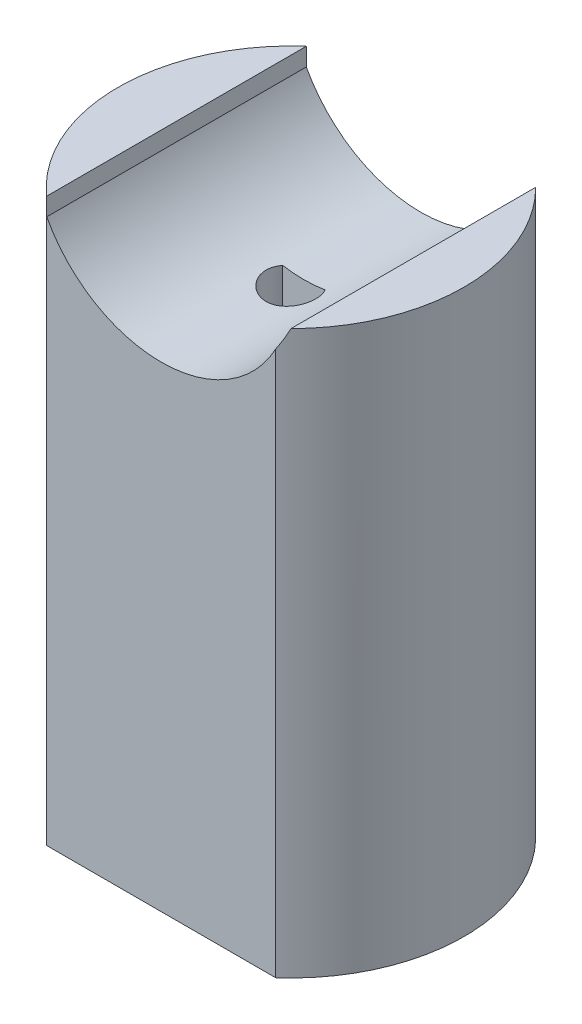
ISO-10303-21;
HEADER;
FILE_DESCRIPTION(('STEP AP214'),'2;1');
FILE_NAME('part.step','',(''),(''),'','','');
FILE_SCHEMA(('AUTOMOTIVE_DESIGN { 1 0 10303 214 1 1 1 1 }'));
ENDSEC;
DATA;
#1=APPLICATION_CONTEXT('core data for automotive mechanical design processes');
#2=APPLICATION_PROTOCOL_DEFINITION('international standard','automotive_design',2000,#1);
#3=PRODUCT_CONTEXT('',#1,'mechanical');
#4=PRODUCT('Part','Part','',(#3));
#5=PRODUCT_RELATED_PRODUCT_CATEGORY('part','',(#4));
#6=PRODUCT_DEFINITION_FORMATION('','',#4);
#7=PRODUCT_DEFINITION_CONTEXT('part definition',#1,'design');
#8=PRODUCT_DEFINITION('design','',#6,#7);
#9=PRODUCT_DEFINITION_SHAPE('','',#8);
#10=(LENGTH_UNIT() NAMED_UNIT(*) SI_UNIT(.MILLI.,.METRE.));
#11=(NAMED_UNIT(*) PLANE_ANGLE_UNIT() SI_UNIT($,.RADIAN.));
#12=(NAMED_UNIT(*) SI_UNIT($,.STERADIAN.) SOLID_ANGLE_UNIT());
#13=UNCERTAINTY_MEASURE_WITH_UNIT(LENGTH_MEASURE(1.E-05),#10,'distance_accuracy_value','');
#14=(GEOMETRIC_REPRESENTATION_CONTEXT(3) GLOBAL_UNCERTAINTY_ASSIGNED_CONTEXT((#13)) GLOBAL_UNIT_ASSIGNED_CONTEXT((#10,
#11,#12)) REPRESENTATION_CONTEXT('',''));
#15=CARTESIAN_POINT('',(0.,0.,0.));
#16=DIRECTION('',(0.,0.,1.));
#17=DIRECTION('',(1.,0.,0.));
#18=AXIS2_PLACEMENT_3D('',#15,#16,#17);
#19=CARTESIAN_POINT('',(0.,30.,0.));
#20=DIRECTION('',(0.,-1.,0.));
#21=DIRECTION('',(0.,0.,-1.));
#22=AXIS2_PLACEMENT_3D('',#19,#20,#21);
#23=CYLINDRICAL_SURFACE('',#22,20.);
#24=DIRECTION('',(0.,1.,0.));
#25=VECTOR('',#24,1.);
#26=CARTESIAN_POINT('',(13.228756555323,0.,-15.));
#27=LINE('',#26,#25);
#28=CARTESIAN_POINT('',(13.228756555323,0.,-15.));
#29=VERTEX_POINT('',#28);
#30=CARTESIAN_POINT('',(13.228756555323,62.9289321881345,-15.));
#31=VERTEX_POINT('',#30);
#32=EDGE_CURVE('E157',#29,#31,#27,.T.);
#33=ORIENTED_EDGE('',*,*,#32,.T.);
#34=CARTESIAN_POINT('',(13.228756555323,62.9289321881345,-15.));
#35=CARTESIAN_POINT('',(13.3167171860087,63.0934975431371,-14.9224292995175));
#36=CARTESIAN_POINT('',(13.4018379344791,63.2601242408515,-14.8459809964981));
#37=CARTESIAN_POINT('',(13.566111555391,63.5972085897078,-14.6960179273488));
#38=CARTESIAN_POINT('',(13.6452735857657,63.7676598169233,-14.6224987448622));
#39=CARTESIAN_POINT('',(13.7976215419076,64.1126245505811,-14.4788329603066));
#40=CARTESIAN_POINT('',(13.8708072510773,64.2871382039623,-14.4086864805111));
#41=CARTESIAN_POINT('',(14.011112597924,64.6404390448926,-14.2722923314463));
#42=CARTESIAN_POINT('',(14.0782225176162,64.8192325199306,-14.2060509652797));
#43=CARTESIAN_POINT('',(14.1421356237309,65.,-14.142135623731));
#44=B_SPLINE_CURVE_WITH_KNOTS('',3,(#34,#35,#36,#37,#38,#39,#40,#41,#42,#43),.UNSPECIFIED.,.F.,
.F.,(4,2,2,2,4),(0.,0.606221172995632,1.21149077206819,1.81678229797356,2.42302546377693),.UNSPECIFIED.);
#45=CARTESIAN_POINT('',(14.1421356237309,65.,-14.142135623731));
#46=VERTEX_POINT('',#45);
#47=EDGE_CURVE('E168',#31,#46,#44,.T.);
#48=ORIENTED_EDGE('',*,*,#47,.T.);
#49=CARTESIAN_POINT('',(0.,65.,0.));
#50=DIRECTION('',(0.,-1.,0.));
#51=DIRECTION('',(0.,0.,-1.));
#52=AXIS2_PLACEMENT_3D('',#49,#50,#51);
#53=CIRCLE('',#52,20.);
#54=CARTESIAN_POINT('',(14.1421356237309,65.,14.142135623731));
#55=VERTEX_POINT('',#54);
#56=EDGE_CURVE('E11',#46,#55,#53,.T.);
#57=ORIENTED_EDGE('',*,*,#56,.T.);
#58=CARTESIAN_POINT('',(14.1421356237309,65.,14.142135623731));
#59=CARTESIAN_POINT('',(14.0782225176162,64.8192325199306,14.2060509652797));
#60=CARTESIAN_POINT('',(14.011112597924,64.6404390448926,14.2722923314463));
#61=CARTESIAN_POINT('',(13.8708072510773,64.2871382039623,14.4086864805111));
#62=CARTESIAN_POINT('',(13.7976215419076,64.1126245505811,14.4788329603066));
#63=CARTESIAN_POINT('',(13.6452735857657,63.7676598169233,14.6224987448622));
#64=CARTESIAN_POINT('',(13.566111555391,63.5972085897078,14.6960179273488));
#65=CARTESIAN_POINT('',(13.4018379344791,63.2601242408515,14.8459809964981));
#66=CARTESIAN_POINT('',(13.3167171860087,63.0934975431371,14.9224292995175));
#67=CARTESIAN_POINT('',(13.228756555323,62.9289321881345,15.));
#68=B_SPLINE_CURVE_WITH_KNOTS('',3,(#58,#59,#60,#61,#62,#63,#64,#65,#66,#67),.UNSPECIFIED.,.F.,
.F.,(4,2,2,2,4),(0.,0.606243165803374,1.21153469170874,1.8168042907813,2.42302546377693),.UNSPECIFIED.);
#69=CARTESIAN_POINT('',(13.228756555323,62.9289321881345,15.));
#70=VERTEX_POINT('',#69);
#71=EDGE_CURVE('E187',#55,#70,#68,.T.);
#72=ORIENTED_EDGE('',*,*,#71,.T.);
#73=DIRECTION('',(0.,1.,0.));
#74=VECTOR('',#73,1.);
#75=CARTESIAN_POINT('',(13.228756555323,0.,15.));
#76=LINE('',#75,#74);
#77=CARTESIAN_POINT('',(13.228756555323,0.,15.));
#78=VERTEX_POINT('',#77);
#79=EDGE_CURVE('E169',#78,#70,#76,.T.);
#80=ORIENTED_EDGE('',*,*,#79,.F.);
#81=CARTESIAN_POINT('',(0.,0.,0.));
#82=DIRECTION('',(0.,1.,0.));
#83=DIRECTION('',(0.,0.,1.));
#84=AXIS2_PLACEMENT_3D('',#81,#82,#83);
#85=CIRCLE('',#84,20.);
#86=EDGE_CURVE('E141',#78,#29,#85,.T.);
#87=ORIENTED_EDGE('',*,*,#86,.T.);
#88=EDGE_LOOP('',(#33,#48,#57,#72,#80,#87));
#89=FACE_BOUND('',#88,.T.);
#90=ADVANCED_FACE('F41',(#89),#23,.T.);
#91=DIRECTION('',(0.,-1.,0.));
#92=VECTOR('',#91,1.);
#93=CARTESIAN_POINT('',(-13.228756555323,0.,15.));
#94=LINE('',#93,#92);
#95=CARTESIAN_POINT('',(-13.228756555323,65.,15.));
#96=VERTEX_POINT('',#95);
#97=CARTESIAN_POINT('',(-13.228756555323,62.9289321881345,15.));
#98=VERTEX_POINT('',#97);
#99=EDGE_CURVE('E126',#96,#98,#94,.T.);
#100=ORIENTED_EDGE('',*,*,#99,.F.);
#101=CARTESIAN_POINT('',(0.,65.,0.));
#102=DIRECTION('',(0.,-1.,0.));
#103=DIRECTION('',(0.,0.,-1.));
#104=AXIS2_PLACEMENT_3D('',#101,#102,#103);
#105=CIRCLE('',#104,20.);
#106=CARTESIAN_POINT('',(-13.228756555323,65.,-15.));
#107=VERTEX_POINT('',#106);
#108=EDGE_CURVE('E51',#96,#107,#105,.T.);
#109=ORIENTED_EDGE('',*,*,#108,.T.);
#110=DIRECTION('',(0.,-1.,0.));
#111=VECTOR('',#110,1.);
#112=CARTESIAN_POINT('',(-13.228756555323,0.,-15.));
#113=LINE('',#112,#111);
#114=CARTESIAN_POINT('',(-13.228756555323,62.9289321881345,-15.));
#115=VERTEX_POINT('',#114);
#116=EDGE_CURVE('E115',#107,#115,#113,.T.);
#117=ORIENTED_EDGE('',*,*,#116,.T.);
#118=DIRECTION('',(0.,1.,0.));
#119=VECTOR('',#118,1.);
#120=CARTESIAN_POINT('',(-13.228756555323,0.,-15.));
#121=LINE('',#120,#119);
#122=CARTESIAN_POINT('',(-13.228756555323,0.,-15.));
#123=VERTEX_POINT('',#122);
#124=EDGE_CURVE('E161',#123,#115,#121,.T.);
#125=ORIENTED_EDGE('',*,*,#124,.F.);
#126=CARTESIAN_POINT('',(-13.228756555323,0.,15.));
#127=VERTEX_POINT('',#126);
#128=EDGE_CURVE('E145',#123,#127,#85,.T.);
#129=ORIENTED_EDGE('',*,*,#128,.T.);
#130=DIRECTION('',(0.,1.,0.));
#131=VECTOR('',#130,1.);
#132=CARTESIAN_POINT('',(-13.228756555323,0.,15.));
#133=LINE('',#132,#131);
#134=EDGE_CURVE('E137',#127,#98,#133,.T.);
#135=ORIENTED_EDGE('',*,*,#134,.T.);
#136=EDGE_LOOP('',(#100,#109,#117,#125,#129,#135));
#137=FACE_BOUND('',#136,.T.);
#138=ADVANCED_FACE('F124',(#137),#23,.T.);
#139=CARTESIAN_POINT('',(0.,0.,0.));
#140=DIRECTION('',(0.,1.,0.));
#141=DIRECTION('',(0.,0.,1.));
#142=AXIS2_PLACEMENT_3D('',#139,#140,#141);
#143=PLANE('',#142);
#144=CARTESIAN_POINT('',(0.,0.,0.));
#145=DIRECTION('',(0.,1.,0.));
#146=DIRECTION('',(0.,0.,1.));
#147=AXIS2_PLACEMENT_3D('',#144,#145,#146);
#148=CIRCLE('',#147,2.875);
#149=CARTESIAN_POINT('',(-2.45267710879357,0.,-1.5));
#150=VERTEX_POINT('',#149);
#151=CARTESIAN_POINT('',(2.45267710879357,0.,-1.5));
#152=VERTEX_POINT('',#151);
#153=EDGE_CURVE('E150',#150,#152,#148,.T.);
#154=ORIENTED_EDGE('',*,*,#153,.T.);
#155=DIRECTION('',(1.,0.,0.));
#156=VECTOR('',#155,1.);
#157=CARTESIAN_POINT('',(0.,0.,-1.5));
#158=LINE('',#157,#156);
#159=EDGE_CURVE('E146',#150,#152,#158,.T.);
#160=ORIENTED_EDGE('',*,*,#159,.F.);
#161=EDGE_LOOP('',(#154,#160));
#162=FACE_BOUND('',#161,.T.);
#163=ORIENTED_EDGE('',*,*,#86,.F.);
#164=DIRECTION('',(-1.,0.,0.));
#165=VECTOR('',#164,1.);
#166=CARTESIAN_POINT('',(0.,0.,15.));
#167=LINE('',#166,#165);
#168=EDGE_CURVE('E165',#78,#127,#167,.T.);
#169=ORIENTED_EDGE('',*,*,#168,.T.);
#170=ORIENTED_EDGE('',*,*,#128,.F.);
#171=DIRECTION('',(-1.,0.,0.));
#172=VECTOR('',#171,1.);
#173=CARTESIAN_POINT('',(0.,0.,-15.));
#174=LINE('',#173,#172);
#175=EDGE_CURVE('E162',#29,#123,#174,.T.);
#176=ORIENTED_EDGE('',*,*,#175,.F.);
#177=EDGE_LOOP('',(#163,#169,#170,#176));
#178=FACE_BOUND('',#177,.T.);
#179=ADVANCED_FACE('F235',(#162,#178),#143,.F.);
#180=CARTESIAN_POINT('',(0.,15.,2.74264068711928));
#181=DIRECTION('',(0.,0.,-1.));
#182=DIRECTION('',(-1.,0.,0.));
#183=AXIS2_PLACEMENT_3D('',#180,#181,#182);
#184=CYLINDRICAL_SURFACE('',#183,1.5);
#185=CARTESIAN_POINT('',(0.,15.,-1.5));
#186=DIRECTION('',(0.,0.,-1.));
#187=DIRECTION('',(-1.,0.,0.));
#188=AXIS2_PLACEMENT_3D('',#185,#186,#187);
#189=CIRCLE('',#188,1.5);
#190=CARTESIAN_POINT('',(-1.5,15.,-1.5));
#191=VERTEX_POINT('',#190);
#192=EDGE_CURVE('E136',#191,#191,#189,.F.);
#193=ORIENTED_EDGE('',*,*,#192,.T.);
#194=EDGE_LOOP('',(#193));
#195=FACE_BOUND('',#194,.T.);
#196=CARTESIAN_POINT('',(0.,15.,-15.));
#197=DIRECTION('',(0.,0.,-1.));
#198=DIRECTION('',(-1.,0.,0.));
#199=AXIS2_PLACEMENT_3D('',#196,#197,#198);
#200=CIRCLE('',#199,1.5);
#201=CARTESIAN_POINT('',(-1.5,15.,-15.));
#202=VERTEX_POINT('',#201);
#203=EDGE_CURVE('E133',#202,#202,#200,.F.);
#204=ORIENTED_EDGE('',*,*,#203,.F.);
#205=EDGE_LOOP('',(#204));
#206=FACE_BOUND('',#205,.T.);
#207=ADVANCED_FACE('F262',(#195,#206),#184,.F.);
#208=CARTESIAN_POINT('',(0.,30.,0.));
#209=DIRECTION('',(0.,-1.,0.));
#210=DIRECTION('',(0.,0.,-1.));
#211=AXIS2_PLACEMENT_3D('',#208,#209,#210);
#212=CYLINDRICAL_SURFACE('',#211,2.875);
#213=CARTESIAN_POINT('',(2.45267710879357,55.2018793422949,-1.5));
#214=CARTESIAN_POINT('',(2.49432282266381,55.2087841124069,-1.43191782434283));
#215=CARTESIAN_POINT('',(2.53313417378662,55.2153952608267,-1.36207355029676));
#216=CARTESIAN_POINT('',(2.60484090536377,55.2278591114797,-1.21934313153302));
#217=CARTESIAN_POINT('',(2.63773603614367,55.2337117817008,-1.14645685859773));
#218=CARTESIAN_POINT('',(2.69735030453388,55.2444851951359,-0.998153534604523));
#219=CARTESIAN_POINT('',(2.72407134930357,55.2494062260457,-0.922737273319032));
#220=CARTESIAN_POINT('',(2.77114930327464,55.2581786476486,-0.769908578221655));
#221=CARTESIAN_POINT('',(2.79150645926293,55.2620300798192,-0.692496221942913));
#222=CARTESIAN_POINT('',(2.84280114416713,55.2718036380532,-0.457908088577758));
#223=CARTESIAN_POINT('',(2.86395884075243,55.275944455916,-0.298388842729313));
#224=CARTESIAN_POINT('',(2.87938706363203,55.2789544603487,0.0218426519447952));
#225=CARTESIAN_POINT('',(2.87366927317079,55.2778259375946,0.18255435205891));
#226=CARTESIAN_POINT('',(2.83576453609183,55.2704785975626,0.499257834406765));
#227=CARTESIAN_POINT('',(2.80381469018003,55.2643053795335,0.655278968706301));
#228=CARTESIAN_POINT('',(2.71471978324425,55.2476330147859,0.959737214602934));
#229=CARTESIAN_POINT('',(2.65756791916946,55.2371327000581,1.1081722663262));
#230=CARTESIAN_POINT('',(2.51927182265038,55.2129040141573,1.3943927157981));
#231=CARTESIAN_POINT('',(2.43796420640873,55.1991537952455,1.53209725877369));
#232=CARTESIAN_POINT('',(2.25379632452238,55.1699943246877,1.79203918858683));
#233=CARTESIAN_POINT('',(2.15093555641411,55.1545850343682,1.91427621472723));
#234=CARTESIAN_POINT('',(1.92457367074323,55.1235336823221,2.1419204298096));
#235=CARTESIAN_POINT('',(1.80076218184314,55.1078919402973,2.24701929354108));
#236=CARTESIAN_POINT('',(1.53708594440401,55.0783734749187,2.43499628589791));
#237=CARTESIAN_POINT('',(1.39722070469534,55.0644968055951,2.51787373439305));
#238=CARTESIAN_POINT('',(1.10520582314675,55.0400543526387,2.65903282035849));
#239=CARTESIAN_POINT('',(0.95304937913425,55.0294904183393,2.71730072583001));
#240=CARTESIAN_POINT('',(0.640862610346232,55.0128820958283,2.80736619367151));
#241=CARTESIAN_POINT('',(0.480833222574877,55.0068371711637,2.83916689802177));
#242=CARTESIAN_POINT('',(0.16012008803718,55.0000105233358,2.87499841552132));
#243=CARTESIAN_POINT('',(-0.00051444683591838,54.9991481121947,2.87945498029692));
#244=CARTESIAN_POINT('',(-0.320225654047009,55.0025665070057,2.86159246663139));
#245=CARTESIAN_POINT('',(-0.479302398902501,55.0068470723859,2.83927464061006));
#246=CARTESIAN_POINT('',(-0.79016033927383,55.0200238709493,2.76884141922227));
#247=CARTESIAN_POINT('',(-0.941987479151868,55.0288850780519,2.72092169793834));
#248=CARTESIAN_POINT('',(-1.23545952066419,55.0502405267877,2.60084723388894));
#249=CARTESIAN_POINT('',(-1.37710362885822,55.0627350511393,2.52869060511429));
#250=CARTESIAN_POINT('',(-1.64803837647421,55.0901793461374,2.36119890261169));
#251=CARTESIAN_POINT('',(-1.77716221562841,55.1051565285956,2.26559858419199));
#252=CARTESIAN_POINT('',(-2.01768338022998,55.1358255622843,2.05431425107648));
#253=CARTESIAN_POINT('',(-2.12907924457009,55.1515174722845,1.93862858262413));
#254=CARTESIAN_POINT('',(-2.33251757745799,55.182101615292,1.68858224195858));
#255=CARTESIAN_POINT('',(-2.42427835094297,55.1969801861169,1.55399045584109));
#256=CARTESIAN_POINT('',(-2.58388350931591,55.2240016622127,1.27104313362384));
#257=CARTESIAN_POINT('',(-2.65172825526471,55.2361446087824,1.12268780535532));
#258=CARTESIAN_POINT('',(-2.76113172898097,55.2562132177199,0.817272938410744));
#259=CARTESIAN_POINT('',(-2.80283978794915,55.2641627966941,0.660268529381686));
#260=CARTESIAN_POINT('',(-2.85925603766437,55.2750043760144,0.341315647926953));
#261=CARTESIAN_POINT('',(-2.87396770672223,55.2778970279106,0.179367815163459));
#262=CARTESIAN_POINT('',(-2.87591159752888,55.2782769951482,-0.142023920907941));
#263=CARTESIAN_POINT('',(-2.86358961710953,55.2758520013424,-0.301465425452623));
#264=CARTESIAN_POINT('',(-2.81275088397339,55.2660564358639,-0.615954071018679));
#265=CARTESIAN_POINT('',(-2.77424260693886,55.2586874644118,-0.771002616993614));
#266=CARTESIAN_POINT('',(-2.68902776357378,55.2429568807728,-1.02283950616841));
#267=CARTESIAN_POINT('',(-2.64914403110354,55.2357120571126,-1.1220682362457));
#268=CARTESIAN_POINT('',(-2.55874293392547,55.2197806099623,-1.315228082373));
#269=CARTESIAN_POINT('',(-2.50824390804749,55.2110964784039,-1.40916798500083));
#270=CARTESIAN_POINT('',(-2.45267710879357,55.2018793422949,-1.5));
#271=B_SPLINE_CURVE_WITH_KNOTS('',3,(#213,#214,#215,#216,#217,#218,#219,#220,#221,#222,#223,
#224,#225,#226,#227,#228,#229,#230,#231,#232,#233,#234,#235,#236,#237,#238,#239,#240,#241,#242,
#243,#244,#245,#246,#247,#248,#249,#250,#251,#252,#253,#254,#255,#256,#257,#258,#259,#260,#261,
#262,#263,#264,#265,#266,#267,#268,#269,#270),.UNSPECIFIED.,.F.,.F.,(4,2,2,2,2,2,2,2,2,2,2,2,2,
2,2,2,2,2,2,2,2,2,2,2,2,2,2,2,4),(0.,0.24025045454374,0.480511045682699,0.720697321424595,
0.960874281764317,1.44125250442163,1.92142191757901,2.39729844516877,2.87330350992094,
3.3526044460645,3.83191655728152,4.31907648203617,4.80625131557914,5.29369763217914,
5.7810860746862,6.26086615482706,6.74062379327569,7.21676604899068,7.69294536458149,
8.1747832112012,8.65666074947198,9.14504627048478,9.6334244180139,10.1189861627972,
10.6044853416857,11.0820386673293,11.5594374974752,11.8803790969914,12.2007707333048),.UNSPECIFIED.);
#272=CARTESIAN_POINT('',(2.45267710879357,55.2018793422949,-1.5));
#273=VERTEX_POINT('',#272);
#274=CARTESIAN_POINT('',(-2.45267710879357,55.2018793422949,-1.5));
#275=VERTEX_POINT('',#274);
#276=EDGE_CURVE('E57',#273,#275,#271,.T.);
#277=ORIENTED_EDGE('',*,*,#276,.F.);
#278=DIRECTION('',(0.,-1.,0.));
#279=VECTOR('',#278,1.);
#280=CARTESIAN_POINT('',(2.45267710879357,30.,-1.5));
#281=LINE('',#280,#279);
#282=EDGE_CURVE('E130',#273,#152,#281,.T.);
#283=ORIENTED_EDGE('',*,*,#282,.T.);
#284=ORIENTED_EDGE('',*,*,#153,.F.);
#285=DIRECTION('',(0.,-1.,0.));
#286=VECTOR('',#285,1.);
#287=CARTESIAN_POINT('',(-2.45267710879357,30.,-1.5));
#288=LINE('',#287,#286);
#289=EDGE_CURVE('E128',#275,#150,#288,.T.);
#290=ORIENTED_EDGE('',*,*,#289,.F.);
#291=EDGE_LOOP('',(#277,#283,#284,#290));
#292=FACE_BOUND('',#291,.T.);
#293=ADVANCED_FACE('F43',(#292),#212,.F.);
#294=CARTESIAN_POINT('',(0.,30.,-1.5));
#295=DIRECTION('',(0.,0.,-1.));
#296=DIRECTION('',(-1.,0.,0.));
#297=AXIS2_PLACEMENT_3D('',#294,#295,#296);
#298=PLANE('',#297);
#299=ORIENTED_EDGE('',*,*,#192,.F.);
#300=EDGE_LOOP('',(#299));
#301=FACE_BOUND('',#300,.T.);
#302=ORIENTED_EDGE('',*,*,#282,.F.);
#303=CARTESIAN_POINT('',(0.,70.,-1.5));
#304=DIRECTION('',(0.,0.,-1.));
#305=DIRECTION('',(-1.,0.,0.));
#306=AXIS2_PLACEMENT_3D('',#303,#304,#305);
#307=CIRCLE('',#306,15.);
#308=EDGE_CURVE('E210',#273,#275,#307,.T.);
#309=ORIENTED_EDGE('',*,*,#308,.T.);
#310=ORIENTED_EDGE('',*,*,#289,.T.);
#311=ORIENTED_EDGE('',*,*,#159,.T.);
#312=EDGE_LOOP('',(#302,#309,#310,#311));
#313=FACE_BOUND('',#312,.T.);
#314=ADVANCED_FACE('F251',(#301,#313),#298,.F.);
#315=CARTESIAN_POINT('',(0.,0.,-15.));
#316=DIRECTION('',(0.,0.,-1.));
#317=DIRECTION('',(-1.,0.,0.));
#318=AXIS2_PLACEMENT_3D('',#315,#316,#317);
#319=PLANE('',#318);
#320=CARTESIAN_POINT('',(0.,70.,-15.));
#321=DIRECTION('',(0.,0.,1.));
#322=DIRECTION('',(1.,0.,0.));
#323=AXIS2_PLACEMENT_3D('',#320,#321,#322);
#324=CIRCLE('',#323,15.);
#325=EDGE_CURVE('E112',#115,#31,#324,.T.);
#326=ORIENTED_EDGE('',*,*,#325,.T.);
#327=ORIENTED_EDGE('',*,*,#32,.F.);
#328=ORIENTED_EDGE('',*,*,#175,.T.);
#329=ORIENTED_EDGE('',*,*,#124,.T.);
#330=EDGE_LOOP('',(#326,#327,#328,#329));
#331=FACE_BOUND('',#330,.T.);
#332=ORIENTED_EDGE('',*,*,#203,.T.);
#333=EDGE_LOOP('',(#332));
#334=FACE_BOUND('',#333,.T.);
#335=ADVANCED_FACE('F226',(#331,#334),#319,.T.);
#336=CARTESIAN_POINT('',(0.,0.,15.));
#337=DIRECTION('',(0.,0.,-1.));
#338=DIRECTION('',(-1.,0.,0.));
#339=AXIS2_PLACEMENT_3D('',#336,#337,#338);
#340=PLANE('',#339);
#341=ORIENTED_EDGE('',*,*,#79,.T.);
#342=CARTESIAN_POINT('',(0.,70.,15.));
#343=DIRECTION('',(0.,0.,1.));
#344=DIRECTION('',(1.,0.,0.));
#345=AXIS2_PLACEMENT_3D('',#342,#343,#344);
#346=CIRCLE('',#345,15.);
#347=EDGE_CURVE('E122',#98,#70,#346,.T.);
#348=ORIENTED_EDGE('',*,*,#347,.F.);
#349=ORIENTED_EDGE('',*,*,#134,.F.);
#350=ORIENTED_EDGE('',*,*,#168,.F.);
#351=EDGE_LOOP('',(#341,#348,#349,#350));
#352=FACE_BOUND('',#351,.T.);
#353=ADVANCED_FACE('F243',(#352),#340,.F.);
#354=CARTESIAN_POINT('',(0.,65.,-15.));
#355=DIRECTION('',(0.,-1.,0.));
#356=DIRECTION('',(0.,0.,-1.));
#357=AXIS2_PLACEMENT_3D('',#354,#355,#356);
#358=PLANE('',#357);
#359=DIRECTION('',(0.,0.,1.));
#360=VECTOR('',#359,1.);
#361=CARTESIAN_POINT('',(14.1421356237309,65.,-15.));
#362=LINE('',#361,#360);
#363=EDGE_CURVE('E212',#46,#55,#362,.T.);
#364=ORIENTED_EDGE('',*,*,#363,.T.);
#365=ORIENTED_EDGE('',*,*,#56,.F.);
#366=EDGE_LOOP('',(#364,#365));
#367=FACE_BOUND('',#366,.T.);
#368=ADVANCED_FACE('F200',(#367),#358,.F.);
#369=CARTESIAN_POINT('',(0.,65.,-15.));
#370=DIRECTION('',(0.,-1.,0.));
#371=DIRECTION('',(0.,0.,-1.));
#372=AXIS2_PLACEMENT_3D('',#369,#370,#371);
#373=PLANE('',#372);
#374=DIRECTION('',(0.,0.,1.));
#375=VECTOR('',#374,1.);
#376=CARTESIAN_POINT('',(-13.228756555323,65.,-15.));
#377=LINE('',#376,#375);
#378=EDGE_CURVE('E104',#107,#96,#377,.T.);
#379=ORIENTED_EDGE('',*,*,#378,.F.);
#380=ORIENTED_EDGE('',*,*,#108,.F.);
#381=EDGE_LOOP('',(#379,#380));
#382=FACE_BOUND('',#381,.T.);
#383=ADVANCED_FACE('F106',(#382),#373,.F.);
#384=CARTESIAN_POINT('',(0.,70.,-15.));
#385=DIRECTION('',(0.,0.,1.));
#386=DIRECTION('',(1.,0.,0.));
#387=AXIS2_PLACEMENT_3D('',#384,#385,#386);
#388=CYLINDRICAL_SURFACE('',#387,15.);
#389=ORIENTED_EDGE('',*,*,#276,.T.);
#390=ORIENTED_EDGE('',*,*,#308,.F.);
#391=EDGE_LOOP('',(#389,#390));
#392=FACE_BOUND('',#391,.T.);
#393=ORIENTED_EDGE('',*,*,#325,.F.);
#394=DIRECTION('',(0.,0.,1.));
#395=VECTOR('',#394,1.);
#396=CARTESIAN_POINT('',(-13.228756555323,62.9289321881345,-15.));
#397=LINE('',#396,#395);
#398=EDGE_CURVE('E111',#115,#98,#397,.T.);
#399=ORIENTED_EDGE('',*,*,#398,.T.);
#400=ORIENTED_EDGE('',*,*,#347,.T.);
#401=ORIENTED_EDGE('',*,*,#71,.F.);
#402=ORIENTED_EDGE('',*,*,#363,.F.);
#403=ORIENTED_EDGE('',*,*,#47,.F.);
#404=EDGE_LOOP('',(#393,#399,#400,#401,#402,#403));
#405=FACE_BOUND('',#404,.T.);
#406=ADVANCED_FACE('F195',(#392,#405),#388,.F.);
#407=CARTESIAN_POINT('',(-13.228756555323,0.,-15.));
#408=DIRECTION('',(-1.,0.,0.));
#409=DIRECTION('',(0.,0.,1.));
#410=AXIS2_PLACEMENT_3D('',#407,#408,#409);
#411=PLANE('',#410);
#412=ORIENTED_EDGE('',*,*,#99,.T.);
#413=ORIENTED_EDGE('',*,*,#398,.F.);
#414=ORIENTED_EDGE('',*,*,#116,.F.);
#415=ORIENTED_EDGE('',*,*,#378,.T.);
#416=EDGE_LOOP('',(#412,#413,#414,#415));
#417=FACE_BOUND('',#416,.T.);
#418=ADVANCED_FACE('F116',(#417),#411,.F.);
#419=CLOSED_SHELL('',(#90,#138,#179,#207,#293,#314,#335,#353,#368,#383,#406,#418));
#420=MANIFOLD_SOLID_BREP('B2',#419);
#421=ADVANCED_BREP_SHAPE_REPRESENTATION('',(#18,#420),#14);
#422=SHAPE_DEFINITION_REPRESENTATION(#9,#421);
ENDSEC;
END-ISO-10303-21;
